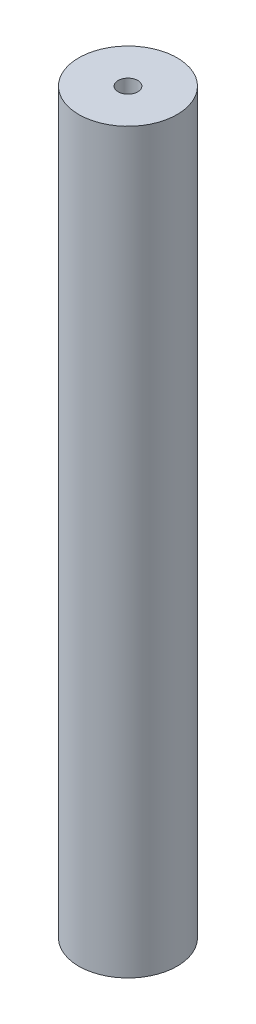
ISO-10303-21;
HEADER;
FILE_DESCRIPTION(('STEP AP214'),'2;1');
FILE_NAME('part.step','',(''),(''),'','','');
FILE_SCHEMA(('AUTOMOTIVE_DESIGN { 1 0 10303 214 1 1 1 1 }'));
ENDSEC;
DATA;
#1=APPLICATION_CONTEXT('core data for automotive mechanical design processes');
#2=APPLICATION_PROTOCOL_DEFINITION('international standard','automotive_design',2000,#1);
#3=PRODUCT_CONTEXT('',#1,'mechanical');
#4=PRODUCT('Part','Part','',(#3));
#5=PRODUCT_RELATED_PRODUCT_CATEGORY('part','',(#4));
#6=PRODUCT_DEFINITION_FORMATION('','',#4);
#7=PRODUCT_DEFINITION_CONTEXT('part definition',#1,'design');
#8=PRODUCT_DEFINITION('design','',#6,#7);
#9=PRODUCT_DEFINITION_SHAPE('','',#8);
#10=(LENGTH_UNIT() NAMED_UNIT(*) SI_UNIT(.MILLI.,.METRE.));
#11=(NAMED_UNIT(*) PLANE_ANGLE_UNIT() SI_UNIT($,.RADIAN.));
#12=(NAMED_UNIT(*) SI_UNIT($,.STERADIAN.) SOLID_ANGLE_UNIT());
#13=UNCERTAINTY_MEASURE_WITH_UNIT(LENGTH_MEASURE(1.E-05),#10,'distance_accuracy_value','');
#14=(GEOMETRIC_REPRESENTATION_CONTEXT(3) GLOBAL_UNCERTAINTY_ASSIGNED_CONTEXT((#13)) GLOBAL_UNIT_ASSIGNED_CONTEXT((#10,
#11,#12)) REPRESENTATION_CONTEXT('',''));
#15=CARTESIAN_POINT('',(0.,0.,0.));
#16=DIRECTION('',(0.,0.,1.));
#17=DIRECTION('',(1.,0.,0.));
#18=AXIS2_PLACEMENT_3D('',#15,#16,#17);
#19=CARTESIAN_POINT('',(0.,300.,0.));
#20=DIRECTION('',(0.,1.,0.));
#21=DIRECTION('',(0.,0.,1.));
#22=AXIS2_PLACEMENT_3D('',#19,#20,#21);
#23=PLANE('',#22);
#24=CARTESIAN_POINT('',(0.,300.,0.));
#25=DIRECTION('',(0.,1.,0.));
#26=DIRECTION('',(0.,0.,1.));
#27=AXIS2_PLACEMENT_3D('',#24,#25,#26);
#28=CIRCLE('',#27,20.);
#29=CARTESIAN_POINT('',(0.,300.,20.));
#30=VERTEX_POINT('',#29);
#31=EDGE_CURVE('E10',#30,#30,#28,.T.);
#32=ORIENTED_EDGE('',*,*,#31,.T.);
#33=EDGE_LOOP('',(#32));
#34=FACE_BOUND('',#33,.T.);
#35=CARTESIAN_POINT('',(0.,300.,0.));
#36=DIRECTION('',(0.,1.,0.));
#37=DIRECTION('',(0.,0.,1.));
#38=AXIS2_PLACEMENT_3D('',#35,#36,#37);
#39=CIRCLE('',#38,4.);
#40=CARTESIAN_POINT('',(0.,300.,4.));
#41=VERTEX_POINT('',#40);
#42=EDGE_CURVE('E50',#41,#41,#39,.T.);
#43=ORIENTED_EDGE('',*,*,#42,.F.);
#44=EDGE_LOOP('',(#43));
#45=FACE_BOUND('',#44,.T.);
#46=ADVANCED_FACE('F37',(#34,#45),#23,.T.);
#47=CARTESIAN_POINT('',(0.,0.,0.));
#48=DIRECTION('',(0.,1.,0.));
#49=DIRECTION('',(0.,0.,1.));
#50=AXIS2_PLACEMENT_3D('',#47,#48,#49);
#51=PLANE('',#50);
#52=CARTESIAN_POINT('',(0.,0.,0.));
#53=DIRECTION('',(0.,1.,0.));
#54=DIRECTION('',(0.,0.,1.));
#55=AXIS2_PLACEMENT_3D('',#52,#53,#54);
#56=CIRCLE('',#55,20.);
#57=CARTESIAN_POINT('',(0.,0.,20.));
#58=VERTEX_POINT('',#57);
#59=EDGE_CURVE('E41',#58,#58,#56,.T.);
#60=ORIENTED_EDGE('',*,*,#59,.F.);
#61=EDGE_LOOP('',(#60));
#62=FACE_BOUND('',#61,.T.);
#63=CARTESIAN_POINT('',(0.,0.,0.));
#64=DIRECTION('',(0.,1.,0.));
#65=DIRECTION('',(0.,0.,1.));
#66=AXIS2_PLACEMENT_3D('',#63,#64,#65);
#67=CIRCLE('',#66,4.);
#68=CARTESIAN_POINT('',(0.,0.,4.));
#69=VERTEX_POINT('',#68);
#70=EDGE_CURVE('E52',#69,#69,#67,.T.);
#71=ORIENTED_EDGE('',*,*,#70,.T.);
#72=EDGE_LOOP('',(#71));
#73=FACE_BOUND('',#72,.T.);
#74=ADVANCED_FACE('F64',(#62,#73),#51,.F.);
#75=CARTESIAN_POINT('',(0.,300.,0.));
#76=DIRECTION('',(0.,-1.,0.));
#77=DIRECTION('',(0.,0.,-1.));
#78=AXIS2_PLACEMENT_3D('',#75,#76,#77);
#79=CYLINDRICAL_SURFACE('',#78,20.);
#80=ORIENTED_EDGE('',*,*,#31,.F.);
#81=EDGE_LOOP('',(#80));
#82=FACE_BOUND('',#81,.T.);
#83=ORIENTED_EDGE('',*,*,#59,.T.);
#84=EDGE_LOOP('',(#83));
#85=FACE_BOUND('',#84,.T.);
#86=ADVANCED_FACE('F39',(#82,#85),#79,.T.);
#87=CARTESIAN_POINT('',(0.,300.,0.));
#88=DIRECTION('',(0.,-1.,0.));
#89=DIRECTION('',(0.,0.,-1.));
#90=AXIS2_PLACEMENT_3D('',#87,#88,#89);
#91=CYLINDRICAL_SURFACE('',#90,4.);
#92=ORIENTED_EDGE('',*,*,#42,.T.);
#93=EDGE_LOOP('',(#92));
#94=FACE_BOUND('',#93,.T.);
#95=ORIENTED_EDGE('',*,*,#70,.F.);
#96=EDGE_LOOP('',(#95));
#97=FACE_BOUND('',#96,.T.);
#98=ADVANCED_FACE('F60',(#94,#97),#91,.F.);
#99=CLOSED_SHELL('',(#46,#74,#86,#98));
#100=MANIFOLD_SOLID_BREP('B2',#99);
#101=ADVANCED_BREP_SHAPE_REPRESENTATION('',(#18,#100),#14);
#102=SHAPE_DEFINITION_REPRESENTATION(#9,#101);
ENDSEC;
END-ISO-10303-21;
